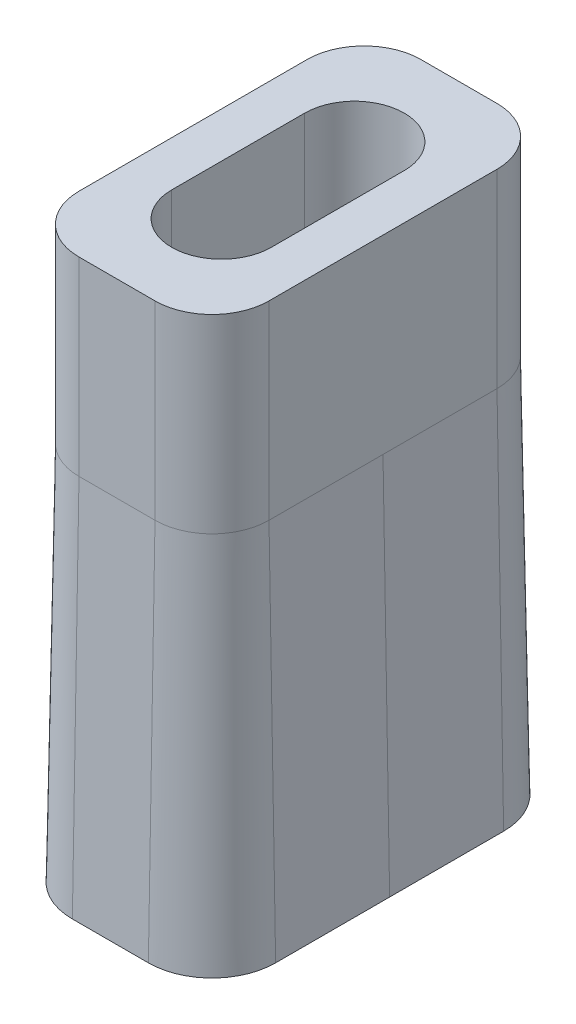
ISO-10303-21;
HEADER;
FILE_DESCRIPTION(('STEP AP214'),'2;1');
FILE_NAME('part.step','',(''),(''),'','','');
FILE_SCHEMA(('AUTOMOTIVE_DESIGN { 1 0 10303 214 1 1 1 1 }'));
ENDSEC;
DATA;
#1=APPLICATION_CONTEXT('core data for automotive mechanical design processes');
#2=APPLICATION_PROTOCOL_DEFINITION('international standard','automotive_design',2000,#1);
#3=PRODUCT_CONTEXT('',#1,'mechanical');
#4=PRODUCT('Part','Part','',(#3));
#5=PRODUCT_RELATED_PRODUCT_CATEGORY('part','',(#4));
#6=PRODUCT_DEFINITION_FORMATION('','',#4);
#7=PRODUCT_DEFINITION_CONTEXT('part definition',#1,'design');
#8=PRODUCT_DEFINITION('design','',#6,#7);
#9=PRODUCT_DEFINITION_SHAPE('','',#8);
#10=(LENGTH_UNIT() NAMED_UNIT(*) SI_UNIT(.MILLI.,.METRE.));
#11=(NAMED_UNIT(*) PLANE_ANGLE_UNIT() SI_UNIT($,.RADIAN.));
#12=(NAMED_UNIT(*) SI_UNIT($,.STERADIAN.) SOLID_ANGLE_UNIT());
#13=UNCERTAINTY_MEASURE_WITH_UNIT(LENGTH_MEASURE(1.E-05),#10,'distance_accuracy_value','');
#14=(GEOMETRIC_REPRESENTATION_CONTEXT(3) GLOBAL_UNCERTAINTY_ASSIGNED_CONTEXT((#13)) GLOBAL_UNIT_ASSIGNED_CONTEXT((#10,
#11,#12)) REPRESENTATION_CONTEXT('',''));
#15=CARTESIAN_POINT('',(0.,0.,0.));
#16=DIRECTION('',(0.,0.,1.));
#17=DIRECTION('',(1.,0.,0.));
#18=AXIS2_PLACEMENT_3D('',#15,#16,#17);
#19=CARTESIAN_POINT('',(5.,-30.,6.));
#20=DIRECTION('',(1.,0.,0.));
#21=DIRECTION('',(0.,0.,-1.));
#22=AXIS2_PLACEMENT_3D('',#19,#20,#21);
#23=PLANE('',#22);
#24=DIRECTION('',(0.,0.,1.));
#25=VECTOR('',#24,1.);
#26=CARTESIAN_POINT('',(5.,-10.,-6.));
#27=LINE('',#26,#25);
#28=CARTESIAN_POINT('',(5.,-10.0000000000002,-6.));
#29=VERTEX_POINT('',#28);
#30=CARTESIAN_POINT('',(5.,-10.,0.));
#31=VERTEX_POINT('',#30);
#32=EDGE_CURVE('E198',#29,#31,#27,.T.);
#33=ORIENTED_EDGE('',*,*,#32,.F.);
#34=DIRECTION('',(0.,1.,0.));
#35=VECTOR('',#34,1.);
#36=CARTESIAN_POINT('',(5.,-30.,-6.));
#37=LINE('',#36,#35);
#38=CARTESIAN_POINT('',(5.,0.,-6.));
#39=VERTEX_POINT('',#38);
#40=EDGE_CURVE('E360',#29,#39,#37,.T.);
#41=ORIENTED_EDGE('',*,*,#40,.T.);
#42=DIRECTION('',(0.,0.,-1.));
#43=VECTOR('',#42,1.);
#44=CARTESIAN_POINT('',(5.,0.,6.));
#45=LINE('',#44,#43);
#46=CARTESIAN_POINT('',(5.,0.,6.));
#47=VERTEX_POINT('',#46);
#48=EDGE_CURVE('E340',#47,#39,#45,.T.);
#49=ORIENTED_EDGE('',*,*,#48,.F.);
#50=DIRECTION('',(0.,1.,0.));
#51=VECTOR('',#50,1.);
#52=CARTESIAN_POINT('',(5.,-30.,6.));
#53=LINE('',#52,#51);
#54=CARTESIAN_POINT('',(5.,-10.0000000000001,6.));
#55=VERTEX_POINT('',#54);
#56=EDGE_CURVE('E362',#55,#47,#53,.T.);
#57=ORIENTED_EDGE('',*,*,#56,.F.);
#58=DIRECTION('',(0.,0.,1.));
#59=VECTOR('',#58,1.);
#60=CARTESIAN_POINT('',(5.,-10.,0.));
#61=LINE('',#60,#59);
#62=EDGE_CURVE('E217',#31,#55,#61,.T.);
#63=ORIENTED_EDGE('',*,*,#62,.F.);
#64=EDGE_LOOP('',(#33,#41,#49,#57,#63));
#65=FACE_BOUND('',#64,.T.);
#66=ADVANCED_FACE('F41',(#65),#23,.T.);
#67=CARTESIAN_POINT('',(-2.,-30.,6.));
#68=DIRECTION('',(0.,1.,0.));
#69=DIRECTION('',(0.,0.,1.));
#70=AXIS2_PLACEMENT_3D('',#67,#68,#69);
#71=CYLINDRICAL_SURFACE('',#70,3.);
#72=CARTESIAN_POINT('',(-2.,-10.,6.));
#73=DIRECTION('',(0.,-1.,0.));
#74=DIRECTION('',(0.,0.,1.));
#75=AXIS2_PLACEMENT_3D('',#72,#73,#74);
#76=CIRCLE('',#75,3.);
#77=CARTESIAN_POINT('',(-2.,-10.,9.));
#78=VERTEX_POINT('',#77);
#79=CARTESIAN_POINT('',(-5.,-10.0000000000002,6.));
#80=VERTEX_POINT('',#79);
#81=EDGE_CURVE('E243',#78,#80,#76,.T.);
#82=ORIENTED_EDGE('',*,*,#81,.F.);
#83=DIRECTION('',(0.,1.,0.));
#84=VECTOR('',#83,1.);
#85=CARTESIAN_POINT('',(-2.,-30.,9.));
#86=LINE('',#85,#84);
#87=CARTESIAN_POINT('',(-2.,0.,9.));
#88=VERTEX_POINT('',#87);
#89=EDGE_CURVE('E45',#78,#88,#86,.T.);
#90=ORIENTED_EDGE('',*,*,#89,.T.);
#91=CARTESIAN_POINT('',(-2.,0.,6.));
#92=DIRECTION('',(0.,1.,0.));
#93=DIRECTION('',(0.,0.,-1.));
#94=AXIS2_PLACEMENT_3D('',#91,#92,#93);
#95=CIRCLE('',#94,3.);
#96=CARTESIAN_POINT('',(-5.,0.,6.));
#97=VERTEX_POINT('',#96);
#98=EDGE_CURVE('E331',#97,#88,#95,.T.);
#99=ORIENTED_EDGE('',*,*,#98,.F.);
#100=DIRECTION('',(0.,1.,0.));
#101=VECTOR('',#100,1.);
#102=CARTESIAN_POINT('',(-5.,-30.,6.));
#103=LINE('',#102,#101);
#104=EDGE_CURVE('E11',#80,#97,#103,.T.);
#105=ORIENTED_EDGE('',*,*,#104,.F.);
#106=EDGE_LOOP('',(#82,#90,#99,#105));
#107=FACE_BOUND('',#106,.T.);
#108=ADVANCED_FACE('F43',(#107),#71,.T.);
#109=CARTESIAN_POINT('',(-5.,-30.,6.));
#110=DIRECTION('',(-1.,0.,0.));
#111=DIRECTION('',(0.,0.,1.));
#112=AXIS2_PLACEMENT_3D('',#109,#110,#111);
#113=PLANE('',#112);
#114=DIRECTION('',(0.,0.,-1.));
#115=VECTOR('',#114,1.);
#116=CARTESIAN_POINT('',(-5.,-10.,6.));
#117=LINE('',#116,#115);
#118=CARTESIAN_POINT('',(-5.,-10.0000000000001,-6.));
#119=VERTEX_POINT('',#118);
#120=EDGE_CURVE('E57',#80,#119,#117,.T.);
#121=ORIENTED_EDGE('',*,*,#120,.F.);
#122=ORIENTED_EDGE('',*,*,#104,.T.);
#123=DIRECTION('',(0.,0.,1.));
#124=VECTOR('',#123,1.);
#125=CARTESIAN_POINT('',(-5.,0.,6.));
#126=LINE('',#125,#124);
#127=CARTESIAN_POINT('',(-5.,0.,-6.));
#128=VERTEX_POINT('',#127);
#129=EDGE_CURVE('E352',#128,#97,#126,.T.);
#130=ORIENTED_EDGE('',*,*,#129,.F.);
#131=DIRECTION('',(0.,1.,0.));
#132=VECTOR('',#131,1.);
#133=CARTESIAN_POINT('',(-5.,-30.,-6.));
#134=LINE('',#133,#132);
#135=EDGE_CURVE('E50',#119,#128,#134,.T.);
#136=ORIENTED_EDGE('',*,*,#135,.F.);
#137=EDGE_LOOP('',(#121,#122,#130,#136));
#138=FACE_BOUND('',#137,.T.);
#139=ADVANCED_FACE('F376',(#138),#113,.T.);
#140=CARTESIAN_POINT('',(-2.,-30.,-6.));
#141=DIRECTION('',(0.,1.,0.));
#142=DIRECTION('',(0.,0.,1.));
#143=AXIS2_PLACEMENT_3D('',#140,#141,#142);
#144=CYLINDRICAL_SURFACE('',#143,3.);
#145=CARTESIAN_POINT('',(-2.,-10.,-6.));
#146=DIRECTION('',(0.,-1.,0.));
#147=DIRECTION('',(-1.,0.,0.));
#148=AXIS2_PLACEMENT_3D('',#145,#146,#147);
#149=CIRCLE('',#148,3.);
#150=CARTESIAN_POINT('',(-2.,-10.0000000000002,-9.));
#151=VERTEX_POINT('',#150);
#152=EDGE_CURVE('E65',#119,#151,#149,.T.);
#153=ORIENTED_EDGE('',*,*,#152,.F.);
#154=ORIENTED_EDGE('',*,*,#135,.T.);
#155=CARTESIAN_POINT('',(-2.,0.,-6.));
#156=DIRECTION('',(0.,1.,0.));
#157=DIRECTION('',(0.,0.,-1.));
#158=AXIS2_PLACEMENT_3D('',#155,#156,#157);
#159=CIRCLE('',#158,3.);
#160=CARTESIAN_POINT('',(-2.,0.,-9.));
#161=VERTEX_POINT('',#160);
#162=EDGE_CURVE('E349',#161,#128,#159,.T.);
#163=ORIENTED_EDGE('',*,*,#162,.F.);
#164=DIRECTION('',(0.,1.,0.));
#165=VECTOR('',#164,1.);
#166=CARTESIAN_POINT('',(-2.,-30.,-9.));
#167=LINE('',#166,#165);
#168=EDGE_CURVE('E356',#151,#161,#167,.T.);
#169=ORIENTED_EDGE('',*,*,#168,.F.);
#170=EDGE_LOOP('',(#153,#154,#163,#169));
#171=FACE_BOUND('',#170,.T.);
#172=ADVANCED_FACE('F403',(#171),#144,.T.);
#173=CARTESIAN_POINT('',(-2.,-30.,-9.));
#174=DIRECTION('',(0.,0.,-1.));
#175=DIRECTION('',(-1.,0.,0.));
#176=AXIS2_PLACEMENT_3D('',#173,#174,#175);
#177=PLANE('',#176);
#178=DIRECTION('',(1.,0.,0.));
#179=VECTOR('',#178,1.);
#180=CARTESIAN_POINT('',(-2.,-10.,-9.));
#181=LINE('',#180,#179);
#182=CARTESIAN_POINT('',(2.,-10.,-9.));
#183=VERTEX_POINT('',#182);
#184=EDGE_CURVE('E268',#151,#183,#181,.T.);
#185=ORIENTED_EDGE('',*,*,#184,.F.);
#186=ORIENTED_EDGE('',*,*,#168,.T.);
#187=DIRECTION('',(-1.,0.,0.));
#188=VECTOR('',#187,1.);
#189=CARTESIAN_POINT('',(-2.,0.,-9.));
#190=LINE('',#189,#188);
#191=CARTESIAN_POINT('',(2.,0.,-9.));
#192=VERTEX_POINT('',#191);
#193=EDGE_CURVE('E346',#192,#161,#190,.T.);
#194=ORIENTED_EDGE('',*,*,#193,.F.);
#195=DIRECTION('',(0.,1.,0.));
#196=VECTOR('',#195,1.);
#197=CARTESIAN_POINT('',(2.,-30.,-9.));
#198=LINE('',#197,#196);
#199=EDGE_CURVE('E358',#183,#192,#198,.T.);
#200=ORIENTED_EDGE('',*,*,#199,.F.);
#201=EDGE_LOOP('',(#185,#186,#194,#200));
#202=FACE_BOUND('',#201,.T.);
#203=ADVANCED_FACE('F402',(#202),#177,.T.);
#204=CARTESIAN_POINT('',(2.,-30.,-6.));
#205=DIRECTION('',(0.,1.,0.));
#206=DIRECTION('',(0.,0.,1.));
#207=AXIS2_PLACEMENT_3D('',#204,#205,#206);
#208=CYLINDRICAL_SURFACE('',#207,3.);
#209=CARTESIAN_POINT('',(2.,-10.,-6.));
#210=DIRECTION('',(0.,-1.,0.));
#211=DIRECTION('',(0.,0.,-1.));
#212=AXIS2_PLACEMENT_3D('',#209,#210,#211);
#213=CIRCLE('',#212,3.);
#214=EDGE_CURVE('E277',#183,#29,#213,.T.);
#215=ORIENTED_EDGE('',*,*,#214,.F.);
#216=ORIENTED_EDGE('',*,*,#199,.T.);
#217=CARTESIAN_POINT('',(2.,0.,-6.));
#218=DIRECTION('',(0.,1.,0.));
#219=DIRECTION('',(0.,0.,-1.));
#220=AXIS2_PLACEMENT_3D('',#217,#218,#219);
#221=CIRCLE('',#220,3.);
#222=EDGE_CURVE('E343',#39,#192,#221,.T.);
#223=ORIENTED_EDGE('',*,*,#222,.F.);
#224=ORIENTED_EDGE('',*,*,#40,.F.);
#225=EDGE_LOOP('',(#215,#216,#223,#224));
#226=FACE_BOUND('',#225,.T.);
#227=ADVANCED_FACE('F399',(#226),#208,.T.);
#228=CARTESIAN_POINT('',(2.,-30.,6.));
#229=DIRECTION('',(0.,1.,0.));
#230=DIRECTION('',(0.,0.,1.));
#231=AXIS2_PLACEMENT_3D('',#228,#229,#230);
#232=CYLINDRICAL_SURFACE('',#231,3.);
#233=CARTESIAN_POINT('',(2.,-10.,6.));
#234=DIRECTION('',(0.,-1.,0.));
#235=DIRECTION('',(1.,0.,0.));
#236=AXIS2_PLACEMENT_3D('',#233,#234,#235);
#237=CIRCLE('',#236,3.);
#238=CARTESIAN_POINT('',(2.,-10.0000000000002,9.));
#239=VERTEX_POINT('',#238);
#240=EDGE_CURVE('E223',#55,#239,#237,.T.);
#241=ORIENTED_EDGE('',*,*,#240,.F.);
#242=ORIENTED_EDGE('',*,*,#56,.T.);
#243=CARTESIAN_POINT('',(2.,0.,6.));
#244=DIRECTION('',(0.,1.,0.));
#245=DIRECTION('',(0.,0.,1.));
#246=AXIS2_PLACEMENT_3D('',#243,#244,#245);
#247=CIRCLE('',#246,3.);
#248=CARTESIAN_POINT('',(2.,0.,9.));
#249=VERTEX_POINT('',#248);
#250=EDGE_CURVE('E337',#249,#47,#247,.T.);
#251=ORIENTED_EDGE('',*,*,#250,.F.);
#252=DIRECTION('',(0.,1.,0.));
#253=VECTOR('',#252,1.);
#254=CARTESIAN_POINT('',(2.,-30.,9.));
#255=LINE('',#254,#253);
#256=EDGE_CURVE('E363',#239,#249,#255,.T.);
#257=ORIENTED_EDGE('',*,*,#256,.F.);
#258=EDGE_LOOP('',(#241,#242,#251,#257));
#259=FACE_BOUND('',#258,.T.);
#260=ADVANCED_FACE('F392',(#259),#232,.T.);
#261=CARTESIAN_POINT('',(-2.,-30.,9.));
#262=DIRECTION('',(0.,0.,1.));
#263=DIRECTION('',(1.,0.,0.));
#264=AXIS2_PLACEMENT_3D('',#261,#262,#263);
#265=PLANE('',#264);
#266=DIRECTION('',(-1.,0.,0.));
#267=VECTOR('',#266,1.);
#268=CARTESIAN_POINT('',(2.,-10.,9.));
#269=LINE('',#268,#267);
#270=EDGE_CURVE('E233',#239,#78,#269,.T.);
#271=ORIENTED_EDGE('',*,*,#270,.F.);
#272=ORIENTED_EDGE('',*,*,#256,.T.);
#273=DIRECTION('',(1.,0.,0.));
#274=VECTOR('',#273,1.);
#275=CARTESIAN_POINT('',(-2.,0.,9.));
#276=LINE('',#275,#274);
#277=EDGE_CURVE('E334',#88,#249,#276,.T.);
#278=ORIENTED_EDGE('',*,*,#277,.F.);
#279=ORIENTED_EDGE('',*,*,#89,.F.);
#280=EDGE_LOOP('',(#271,#272,#278,#279));
#281=FACE_BOUND('',#280,.T.);
#282=ADVANCED_FACE('F371',(#281),#265,.T.);
#283=CARTESIAN_POINT('',(-2.,-30.,6.));
#284=DIRECTION('',(0.,-1.,0.));
#285=DIRECTION('',(0.,0.,-1.));
#286=AXIS2_PLACEMENT_3D('',#283,#284,#285);
#287=PLANE('',#286);
#288=CARTESIAN_POINT('',(0.,-30.,3.5));
#289=DIRECTION('',(0.,-1.,0.));
#290=DIRECTION('',(0.,0.,-1.));
#291=AXIS2_PLACEMENT_3D('',#288,#289,#290);
#292=CIRCLE('',#291,2.62);
#293=CARTESIAN_POINT('',(-2.62,-30.,3.5));
#294=VERTEX_POINT('',#293);
#295=CARTESIAN_POINT('',(2.62,-30.,3.5));
#296=VERTEX_POINT('',#295);
#297=EDGE_CURVE('E305',#294,#296,#292,.F.);
#298=ORIENTED_EDGE('',*,*,#297,.T.);
#299=DIRECTION('',(0.,0.,-1.));
#300=VECTOR('',#299,1.);
#301=CARTESIAN_POINT('',(2.62,-30.,3.5));
#302=LINE('',#301,#300);
#303=CARTESIAN_POINT('',(2.62,-30.,-3.5));
#304=VERTEX_POINT('',#303);
#305=EDGE_CURVE('E322',#296,#304,#302,.T.);
#306=ORIENTED_EDGE('',*,*,#305,.T.);
#307=CARTESIAN_POINT('',(0.,-30.,-3.5));
#308=DIRECTION('',(0.,-1.,0.));
#309=DIRECTION('',(0.,0.,-1.));
#310=AXIS2_PLACEMENT_3D('',#307,#308,#309);
#311=CIRCLE('',#310,2.62);
#312=CARTESIAN_POINT('',(-2.62,-30.,-3.5));
#313=VERTEX_POINT('',#312);
#314=EDGE_CURVE('E283',#304,#313,#311,.F.);
#315=ORIENTED_EDGE('',*,*,#314,.T.);
#316=DIRECTION('',(0.,0.,1.));
#317=VECTOR('',#316,1.);
#318=CARTESIAN_POINT('',(-2.62,-30.,3.5));
#319=LINE('',#318,#317);
#320=EDGE_CURVE('E302',#313,#294,#319,.T.);
#321=ORIENTED_EDGE('',*,*,#320,.T.);
#322=EDGE_LOOP('',(#298,#306,#315,#321));
#323=FACE_BOUND('',#322,.T.);
#324=DIRECTION('',(-1.,0.,0.));
#325=VECTOR('',#324,1.);
#326=CARTESIAN_POINT('',(2.,-30.,9.34910129856421));
#327=LINE('',#326,#325);
#328=CARTESIAN_POINT('',(2.,-30.,9.34910129856421));
#329=VERTEX_POINT('',#328);
#330=CARTESIAN_POINT('',(-2.,-30.,9.34910129856421));
#331=VERTEX_POINT('',#330);
#332=EDGE_CURVE('E234',#329,#331,#327,.T.);
#333=ORIENTED_EDGE('',*,*,#332,.T.);
#334=CARTESIAN_POINT('',(-2.,-30.,6.));
#335=DIRECTION('',(0.,-1.,0.));
#336=DIRECTION('',(0.,0.,1.));
#337=AXIS2_PLACEMENT_3D('',#334,#335,#336);
#338=CIRCLE('',#337,3.34910129856422);
#339=CARTESIAN_POINT('',(-5.34910129856422,-30.,6.));
#340=VERTEX_POINT('',#339);
#341=EDGE_CURVE('E244',#331,#340,#338,.T.);
#342=ORIENTED_EDGE('',*,*,#341,.T.);
#343=DIRECTION('',(0.,0.,-1.));
#344=VECTOR('',#343,1.);
#345=CARTESIAN_POINT('',(-5.34910129856422,-30.,6.));
#346=LINE('',#345,#344);
#347=CARTESIAN_POINT('',(-5.34910129856422,-30.,-6.));
#348=VERTEX_POINT('',#347);
#349=EDGE_CURVE('E255',#340,#348,#346,.T.);
#350=ORIENTED_EDGE('',*,*,#349,.T.);
#351=CARTESIAN_POINT('',(-2.,-30.,-6.));
#352=DIRECTION('',(0.,-1.,0.));
#353=DIRECTION('',(-1.,0.,0.));
#354=AXIS2_PLACEMENT_3D('',#351,#352,#353);
#355=CIRCLE('',#354,3.34910129856422);
#356=CARTESIAN_POINT('',(-2.,-30.,-9.34910129856422));
#357=VERTEX_POINT('',#356);
#358=EDGE_CURVE('E260',#348,#357,#355,.T.);
#359=ORIENTED_EDGE('',*,*,#358,.T.);
#360=DIRECTION('',(1.,0.,0.));
#361=VECTOR('',#360,1.);
#362=CARTESIAN_POINT('',(-2.,-30.,-9.34910129856422));
#363=LINE('',#362,#361);
#364=CARTESIAN_POINT('',(2.,-30.,-9.34910129856422));
#365=VERTEX_POINT('',#364);
#366=EDGE_CURVE('E269',#357,#365,#363,.T.);
#367=ORIENTED_EDGE('',*,*,#366,.T.);
#368=CARTESIAN_POINT('',(2.,-30.,-6.));
#369=DIRECTION('',(0.,-1.,0.));
#370=DIRECTION('',(0.,0.,-1.));
#371=AXIS2_PLACEMENT_3D('',#368,#369,#370);
#372=CIRCLE('',#371,3.34910129856422);
#373=CARTESIAN_POINT('',(5.34910129856422,-30.,-6.));
#374=VERTEX_POINT('',#373);
#375=EDGE_CURVE('E278',#365,#374,#372,.T.);
#376=ORIENTED_EDGE('',*,*,#375,.T.);
#377=DIRECTION('',(0.,0.,1.));
#378=VECTOR('',#377,1.);
#379=CARTESIAN_POINT('',(5.34910129856422,-30.,-6.));
#380=LINE('',#379,#378);
#381=CARTESIAN_POINT('',(5.34910129856422,-30.,0.));
#382=VERTEX_POINT('',#381);
#383=EDGE_CURVE('E188',#374,#382,#380,.T.);
#384=ORIENTED_EDGE('',*,*,#383,.T.);
#385=DIRECTION('',(0.,0.,1.));
#386=VECTOR('',#385,1.);
#387=CARTESIAN_POINT('',(5.34910129856422,-30.,0.));
#388=LINE('',#387,#386);
#389=CARTESIAN_POINT('',(5.34910129856422,-30.,6.));
#390=VERTEX_POINT('',#389);
#391=EDGE_CURVE('E204',#382,#390,#388,.T.);
#392=ORIENTED_EDGE('',*,*,#391,.T.);
#393=CARTESIAN_POINT('',(2.,-30.,6.));
#394=DIRECTION('',(0.,-1.,0.));
#395=DIRECTION('',(1.,0.,0.));
#396=AXIS2_PLACEMENT_3D('',#393,#394,#395);
#397=CIRCLE('',#396,3.34910129856422);
#398=EDGE_CURVE('E224',#390,#329,#397,.T.);
#399=ORIENTED_EDGE('',*,*,#398,.T.);
#400=EDGE_LOOP('',(#333,#342,#350,#359,#367,#376,#384,#392,#399));
#401=FACE_BOUND('',#400,.T.);
#402=ADVANCED_FACE('F190',(#323,#401),#287,.T.);
#403=CARTESIAN_POINT('',(-2.,0.,6.));
#404=DIRECTION('',(0.,-1.,0.));
#405=DIRECTION('',(0.,0.,-1.));
#406=AXIS2_PLACEMENT_3D('',#403,#404,#405);
#407=PLANE('',#406);
#408=DIRECTION('',(0.,0.,-1.));
#409=VECTOR('',#408,1.);
#410=CARTESIAN_POINT('',(2.62,0.,3.5));
#411=LINE('',#410,#409);
#412=CARTESIAN_POINT('',(2.62,0.,3.5));
#413=VERTEX_POINT('',#412);
#414=CARTESIAN_POINT('',(2.62,0.,-3.5));
#415=VERTEX_POINT('',#414);
#416=EDGE_CURVE('E310',#413,#415,#411,.T.);
#417=ORIENTED_EDGE('',*,*,#416,.F.);
#418=CARTESIAN_POINT('',(0.,0.,3.5));
#419=DIRECTION('',(0.,1.,0.));
#420=DIRECTION('',(0.,0.,1.));
#421=AXIS2_PLACEMENT_3D('',#418,#419,#420);
#422=CIRCLE('',#421,2.62);
#423=CARTESIAN_POINT('',(-2.62,0.,3.5));
#424=VERTEX_POINT('',#423);
#425=EDGE_CURVE('E308',#424,#413,#422,.T.);
#426=ORIENTED_EDGE('',*,*,#425,.F.);
#427=DIRECTION('',(0.,0.,1.));
#428=VECTOR('',#427,1.);
#429=CARTESIAN_POINT('',(-2.62,0.,3.5));
#430=LINE('',#429,#428);
#431=CARTESIAN_POINT('',(-2.62,0.,-3.5));
#432=VERTEX_POINT('',#431);
#433=EDGE_CURVE('E316',#432,#424,#430,.T.);
#434=ORIENTED_EDGE('',*,*,#433,.F.);
#435=CARTESIAN_POINT('',(0.,0.,-3.5));
#436=DIRECTION('',(0.,1.,0.));
#437=DIRECTION('',(0.,0.,1.));
#438=AXIS2_PLACEMENT_3D('',#435,#436,#437);
#439=CIRCLE('',#438,2.62);
#440=EDGE_CURVE('E313',#415,#432,#439,.T.);
#441=ORIENTED_EDGE('',*,*,#440,.F.);
#442=EDGE_LOOP('',(#417,#426,#434,#441));
#443=FACE_BOUND('',#442,.T.);
#444=ORIENTED_EDGE('',*,*,#98,.T.);
#445=ORIENTED_EDGE('',*,*,#277,.T.);
#446=ORIENTED_EDGE('',*,*,#250,.T.);
#447=ORIENTED_EDGE('',*,*,#48,.T.);
#448=ORIENTED_EDGE('',*,*,#222,.T.);
#449=ORIENTED_EDGE('',*,*,#193,.T.);
#450=ORIENTED_EDGE('',*,*,#162,.T.);
#451=ORIENTED_EDGE('',*,*,#129,.T.);
#452=EDGE_LOOP('',(#444,#445,#446,#447,#448,#449,#450,#451));
#453=FACE_BOUND('',#452,.T.);
#454=ADVANCED_FACE('F373',(#443,#453),#407,.F.);
#455=CARTESIAN_POINT('',(0.,-30.001,3.5));
#456=DIRECTION('',(0.,1.,0.));
#457=DIRECTION('',(0.,0.,1.));
#458=AXIS2_PLACEMENT_3D('',#455,#456,#457);
#459=CYLINDRICAL_SURFACE('',#458,2.62);
#460=DIRECTION('',(0.,1.,0.));
#461=VECTOR('',#460,1.);
#462=CARTESIAN_POINT('',(-2.62,-30.001,3.5));
#463=LINE('',#462,#461);
#464=EDGE_CURVE('E320',#294,#424,#463,.T.);
#465=ORIENTED_EDGE('',*,*,#464,.T.);
#466=ORIENTED_EDGE('',*,*,#425,.T.);
#467=DIRECTION('',(0.,1.,0.));
#468=VECTOR('',#467,1.);
#469=CARTESIAN_POINT('',(2.62,-30.001,3.5));
#470=LINE('',#469,#468);
#471=EDGE_CURVE('E319',#296,#413,#470,.T.);
#472=ORIENTED_EDGE('',*,*,#471,.F.);
#473=ORIENTED_EDGE('',*,*,#297,.F.);
#474=EDGE_LOOP('',(#465,#466,#472,#473));
#475=FACE_BOUND('',#474,.T.);
#476=ADVANCED_FACE('F431',(#475),#459,.F.);
#477=CARTESIAN_POINT('',(-2.62,-30.001,3.5));
#478=DIRECTION('',(-1.,0.,0.));
#479=DIRECTION('',(0.,0.,1.));
#480=AXIS2_PLACEMENT_3D('',#477,#478,#479);
#481=PLANE('',#480);
#482=DIRECTION('',(0.,1.,0.));
#483=VECTOR('',#482,1.);
#484=CARTESIAN_POINT('',(-2.62,-30.001,-3.5));
#485=LINE('',#484,#483);
#486=EDGE_CURVE('E323',#313,#432,#485,.T.);
#487=ORIENTED_EDGE('',*,*,#486,.T.);
#488=ORIENTED_EDGE('',*,*,#433,.T.);
#489=ORIENTED_EDGE('',*,*,#464,.F.);
#490=ORIENTED_EDGE('',*,*,#320,.F.);
#491=EDGE_LOOP('',(#487,#488,#489,#490));
#492=FACE_BOUND('',#491,.T.);
#493=ADVANCED_FACE('F437',(#492),#481,.F.);
#494=CARTESIAN_POINT('',(0.,-30.001,-3.5));
#495=DIRECTION('',(0.,1.,0.));
#496=DIRECTION('',(0.,0.,1.));
#497=AXIS2_PLACEMENT_3D('',#494,#495,#496);
#498=CYLINDRICAL_SURFACE('',#497,2.62);
#499=DIRECTION('',(0.,1.,0.));
#500=VECTOR('',#499,1.);
#501=CARTESIAN_POINT('',(2.62,-30.001,-3.5));
#502=LINE('',#501,#500);
#503=EDGE_CURVE('E325',#304,#415,#502,.T.);
#504=ORIENTED_EDGE('',*,*,#503,.T.);
#505=ORIENTED_EDGE('',*,*,#440,.T.);
#506=ORIENTED_EDGE('',*,*,#486,.F.);
#507=ORIENTED_EDGE('',*,*,#314,.F.);
#508=EDGE_LOOP('',(#504,#505,#506,#507));
#509=FACE_BOUND('',#508,.T.);
#510=ADVANCED_FACE('F442',(#509),#498,.F.);
#511=CARTESIAN_POINT('',(2.62,-30.001,3.5));
#512=DIRECTION('',(1.,0.,0.));
#513=DIRECTION('',(0.,0.,-1.));
#514=AXIS2_PLACEMENT_3D('',#511,#512,#513);
#515=PLANE('',#514);
#516=ORIENTED_EDGE('',*,*,#471,.T.);
#517=ORIENTED_EDGE('',*,*,#416,.T.);
#518=ORIENTED_EDGE('',*,*,#503,.F.);
#519=ORIENTED_EDGE('',*,*,#305,.F.);
#520=EDGE_LOOP('',(#516,#517,#518,#519));
#521=FACE_BOUND('',#520,.T.);
#522=ADVANCED_FACE('F439',(#521),#515,.F.);
#523=CARTESIAN_POINT('',(2.,-30.,-6.));
#524=DIRECTION('',(0.,-1.,0.));
#525=DIRECTION('',(0.,0.,-1.));
#526=AXIS2_PLACEMENT_3D('',#523,#524,#525);
#527=CONICAL_SURFACE('',#526,3.34910129856422,0.0174532925199366);
#528=ORIENTED_EDGE('',*,*,#214,.T.);
#529=DIRECTION('',(-0.0174524064372768,0.999847695156391,0.));
#530=VECTOR('',#529,1.);
#531=CARTESIAN_POINT('',(5.,-10.,-6.));
#532=LINE('',#531,#530);
#533=EDGE_CURVE('E275',#374,#29,#532,.T.);
#534=ORIENTED_EDGE('',*,*,#533,.F.);
#535=ORIENTED_EDGE('',*,*,#375,.F.);
#536=DIRECTION('',(0.,0.999847695156391,0.0174524064372768));
#537=VECTOR('',#536,1.);
#538=CARTESIAN_POINT('',(2.,-10.,-9.));
#539=LINE('',#538,#537);
#540=EDGE_CURVE('E265',#365,#183,#539,.T.);
#541=ORIENTED_EDGE('',*,*,#540,.T.);
#542=EDGE_LOOP('',(#528,#534,#535,#541));
#543=FACE_BOUND('',#542,.T.);
#544=ADVANCED_FACE('F441',(#543),#527,.T.);
#545=CARTESIAN_POINT('',(-2.,-10.,-9.));
#546=DIRECTION('',(0.,0.0174524064372768,-0.999847695156391));
#547=DIRECTION('',(0.,0.999847695156391,0.0174524064372768));
#548=AXIS2_PLACEMENT_3D('',#545,#546,#547);
#549=PLANE('',#548);
#550=ORIENTED_EDGE('',*,*,#184,.T.);
#551=ORIENTED_EDGE('',*,*,#540,.F.);
#552=ORIENTED_EDGE('',*,*,#366,.F.);
#553=DIRECTION('',(0.,0.999847695156391,0.0174524064372768));
#554=VECTOR('',#553,1.);
#555=CARTESIAN_POINT('',(-2.,-10.,-9.));
#556=LINE('',#555,#554);
#557=EDGE_CURVE('E257',#357,#151,#556,.T.);
#558=ORIENTED_EDGE('',*,*,#557,.T.);
#559=EDGE_LOOP('',(#550,#551,#552,#558));
#560=FACE_BOUND('',#559,.T.);
#561=ADVANCED_FACE('F453',(#560),#549,.T.);
#562=CARTESIAN_POINT('',(-2.,-30.,-6.));
#563=DIRECTION('',(0.,-1.,0.));
#564=DIRECTION('',(0.,0.,-1.));
#565=AXIS2_PLACEMENT_3D('',#562,#563,#564);
#566=CONICAL_SURFACE('',#565,3.34910129856422,0.0174532925199366);
#567=ORIENTED_EDGE('',*,*,#152,.T.);
#568=ORIENTED_EDGE('',*,*,#557,.F.);
#569=ORIENTED_EDGE('',*,*,#358,.F.);
#570=DIRECTION('',(0.0174524064372768,0.999847695156391,0.));
#571=VECTOR('',#570,1.);
#572=CARTESIAN_POINT('',(-5.,-10.,-6.));
#573=LINE('',#572,#571);
#574=EDGE_CURVE('E250',#348,#119,#573,.T.);
#575=ORIENTED_EDGE('',*,*,#574,.T.);
#576=EDGE_LOOP('',(#567,#568,#569,#575));
#577=FACE_BOUND('',#576,.T.);
#578=ADVANCED_FACE('F457',(#577),#566,.T.);
#579=CARTESIAN_POINT('',(-5.,-10.,6.));
#580=DIRECTION('',(-0.999847695156391,0.0174524064372768,0.));
#581=DIRECTION('',(-0.0174524064372768,-0.999847695156391,0.));
#582=AXIS2_PLACEMENT_3D('',#579,#580,#581);
#583=PLANE('',#582);
#584=ORIENTED_EDGE('',*,*,#120,.T.);
#585=ORIENTED_EDGE('',*,*,#574,.F.);
#586=ORIENTED_EDGE('',*,*,#349,.F.);
#587=DIRECTION('',(0.0174524064372768,0.999847695156391,0.));
#588=VECTOR('',#587,1.);
#589=CARTESIAN_POINT('',(-5.,-10.,6.));
#590=LINE('',#589,#588);
#591=EDGE_CURVE('E240',#340,#80,#590,.T.);
#592=ORIENTED_EDGE('',*,*,#591,.T.);
#593=EDGE_LOOP('',(#584,#585,#586,#592));
#594=FACE_BOUND('',#593,.T.);
#595=ADVANCED_FACE('F382',(#594),#583,.T.);
#596=CARTESIAN_POINT('',(-2.,-30.,6.));
#597=DIRECTION('',(0.,-1.,0.));
#598=DIRECTION('',(0.,0.,-1.));
#599=AXIS2_PLACEMENT_3D('',#596,#597,#598);
#600=CONICAL_SURFACE('',#599,3.34910129856422,0.0174532925199366);
#601=ORIENTED_EDGE('',*,*,#81,.T.);
#602=ORIENTED_EDGE('',*,*,#591,.F.);
#603=ORIENTED_EDGE('',*,*,#341,.F.);
#604=DIRECTION('',(0.,0.999847695156391,-0.0174524064372768));
#605=VECTOR('',#604,1.);
#606=CARTESIAN_POINT('',(-2.,-10.,9.));
#607=LINE('',#606,#605);
#608=EDGE_CURVE('E230',#331,#78,#607,.T.);
#609=ORIENTED_EDGE('',*,*,#608,.T.);
#610=EDGE_LOOP('',(#601,#602,#603,#609));
#611=FACE_BOUND('',#610,.T.);
#612=ADVANCED_FACE('F379',(#611),#600,.T.);
#613=CARTESIAN_POINT('',(2.,-10.,9.));
#614=DIRECTION('',(0.,0.0174524064372768,0.999847695156391));
#615=DIRECTION('',(0.,-0.999847695156391,0.0174524064372768));
#616=AXIS2_PLACEMENT_3D('',#613,#614,#615);
#617=PLANE('',#616);
#618=ORIENTED_EDGE('',*,*,#270,.T.);
#619=ORIENTED_EDGE('',*,*,#608,.F.);
#620=ORIENTED_EDGE('',*,*,#332,.F.);
#621=DIRECTION('',(0.,0.999847695156391,-0.0174524064372768));
#622=VECTOR('',#621,1.);
#623=CARTESIAN_POINT('',(2.,-10.,9.));
#624=LINE('',#623,#622);
#625=EDGE_CURVE('E220',#329,#239,#624,.T.);
#626=ORIENTED_EDGE('',*,*,#625,.T.);
#627=EDGE_LOOP('',(#618,#619,#620,#626));
#628=FACE_BOUND('',#627,.T.);
#629=ADVANCED_FACE('F386',(#628),#617,.T.);
#630=CARTESIAN_POINT('',(2.,-30.,6.));
#631=DIRECTION('',(0.,-1.,0.));
#632=DIRECTION('',(0.,0.,-1.));
#633=AXIS2_PLACEMENT_3D('',#630,#631,#632);
#634=CONICAL_SURFACE('',#633,3.34910129856422,0.0174532925199366);
#635=ORIENTED_EDGE('',*,*,#240,.T.);
#636=ORIENTED_EDGE('',*,*,#625,.F.);
#637=ORIENTED_EDGE('',*,*,#398,.F.);
#638=DIRECTION('',(-0.0174524064372768,0.999847695156391,0.));
#639=VECTOR('',#638,1.);
#640=CARTESIAN_POINT('',(5.,-10.,6.));
#641=LINE('',#640,#639);
#642=EDGE_CURVE('E209',#390,#55,#641,.T.);
#643=ORIENTED_EDGE('',*,*,#642,.T.);
#644=EDGE_LOOP('',(#635,#636,#637,#643));
#645=FACE_BOUND('',#644,.T.);
#646=ADVANCED_FACE('F389',(#645),#634,.T.);
#647=CARTESIAN_POINT('',(5.,-10.,0.));
#648=DIRECTION('',(0.999847695156391,0.0174524064372768,0.));
#649=DIRECTION('',(-0.0174524064372768,0.999847695156391,0.));
#650=AXIS2_PLACEMENT_3D('',#647,#648,#649);
#651=PLANE('',#650);
#652=ORIENTED_EDGE('',*,*,#62,.T.);
#653=ORIENTED_EDGE('',*,*,#642,.F.);
#654=ORIENTED_EDGE('',*,*,#391,.F.);
#655=DIRECTION('',(-0.0174524064372768,0.999847695156391,0.));
#656=VECTOR('',#655,1.);
#657=CARTESIAN_POINT('',(5.,-10.,0.));
#658=LINE('',#657,#656);
#659=EDGE_CURVE('E207',#382,#31,#658,.T.);
#660=ORIENTED_EDGE('',*,*,#659,.T.);
#661=EDGE_LOOP('',(#652,#653,#654,#660));
#662=FACE_BOUND('',#661,.T.);
#663=ADVANCED_FACE('F206',(#662),#651,.T.);
#664=CARTESIAN_POINT('',(5.,-10.,-6.));
#665=DIRECTION('',(0.999847695156391,0.0174524064372768,0.));
#666=DIRECTION('',(-0.0174524064372768,0.999847695156391,0.));
#667=AXIS2_PLACEMENT_3D('',#664,#665,#666);
#668=PLANE('',#667);
#669=ORIENTED_EDGE('',*,*,#533,.T.);
#670=ORIENTED_EDGE('',*,*,#32,.T.);
#671=ORIENTED_EDGE('',*,*,#659,.F.);
#672=ORIENTED_EDGE('',*,*,#383,.F.);
#673=EDGE_LOOP('',(#669,#670,#671,#672));
#674=FACE_BOUND('',#673,.T.);
#675=ADVANCED_FACE('F213',(#674),#668,.T.);
#676=CLOSED_SHELL('',(#66,#108,#139,#172,#203,#227,#260,#282,#402,#454,#476,#493,#510,#522,#544,
#561,#578,#595,#612,#629,#646,#663,#675));
#677=MANIFOLD_SOLID_BREP('B2',#676);
#678=ADVANCED_BREP_SHAPE_REPRESENTATION('',(#18,#677),#14);
#679=SHAPE_DEFINITION_REPRESENTATION(#9,#678);
ENDSEC;
END-ISO-10303-21;
